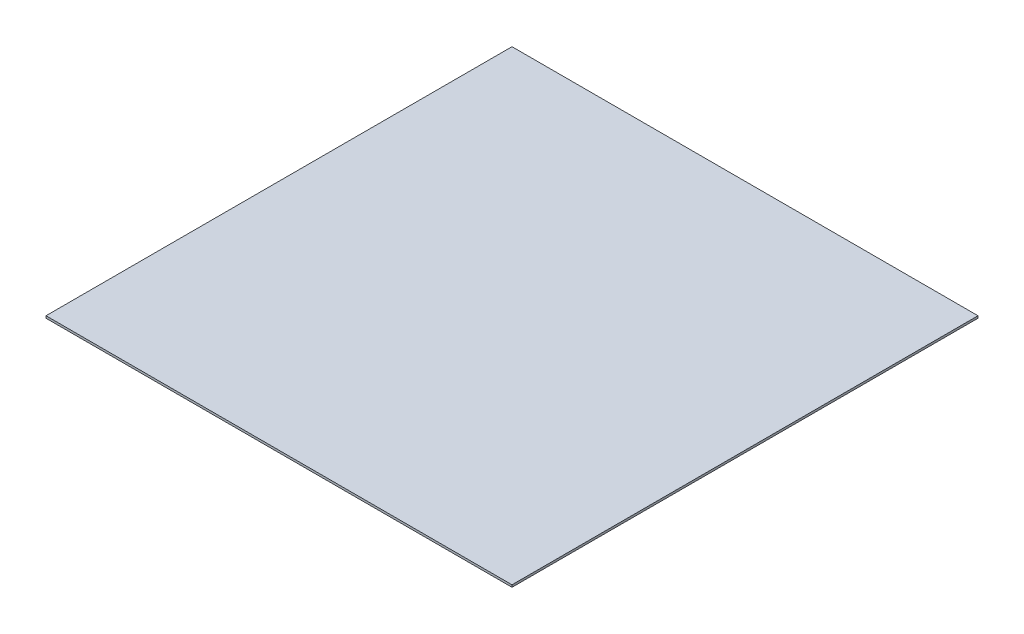
ISO-10303-21;
HEADER;
FILE_DESCRIPTION(('STEP AP214'),'2;1');
FILE_NAME('part.step','',(''),(''),'','','');
FILE_SCHEMA(('AUTOMOTIVE_DESIGN { 1 0 10303 214 1 1 1 1 }'));
ENDSEC;
DATA;
#1=APPLICATION_CONTEXT('core data for automotive mechanical design processes');
#2=APPLICATION_PROTOCOL_DEFINITION('international standard','automotive_design',2000,#1);
#3=PRODUCT_CONTEXT('',#1,'mechanical');
#4=PRODUCT('Part','Part','',(#3));
#5=PRODUCT_RELATED_PRODUCT_CATEGORY('part','',(#4));
#6=PRODUCT_DEFINITION_FORMATION('','',#4);
#7=PRODUCT_DEFINITION_CONTEXT('part definition',#1,'design');
#8=PRODUCT_DEFINITION('design','',#6,#7);
#9=PRODUCT_DEFINITION_SHAPE('','',#8);
#10=(LENGTH_UNIT() NAMED_UNIT(*) SI_UNIT(.MILLI.,.METRE.));
#11=(NAMED_UNIT(*) PLANE_ANGLE_UNIT() SI_UNIT($,.RADIAN.));
#12=(NAMED_UNIT(*) SI_UNIT($,.STERADIAN.) SOLID_ANGLE_UNIT());
#13=UNCERTAINTY_MEASURE_WITH_UNIT(LENGTH_MEASURE(1.E-05),#10,'distance_accuracy_value','');
#14=(GEOMETRIC_REPRESENTATION_CONTEXT(3) GLOBAL_UNCERTAINTY_ASSIGNED_CONTEXT((#13)) GLOBAL_UNIT_ASSIGNED_CONTEXT((#10,
#11,#12)) REPRESENTATION_CONTEXT('',''));
#15=CARTESIAN_POINT('',(0.,0.,0.));
#16=DIRECTION('',(0.,0.,1.));
#17=DIRECTION('',(1.,0.,0.));
#18=AXIS2_PLACEMENT_3D('',#15,#16,#17);
#19=CARTESIAN_POINT('',(-743.,7.,743.));
#20=DIRECTION('',(-1.,0.,0.));
#21=DIRECTION('',(0.,0.,1.));
#22=AXIS2_PLACEMENT_3D('',#19,#20,#21);
#23=PLANE('',#22);
#24=DIRECTION('',(0.,0.,-1.));
#25=VECTOR('',#24,1.);
#26=CARTESIAN_POINT('',(-743.,0.,743.));
#27=LINE('',#26,#25);
#28=CARTESIAN_POINT('',(-743.,0.,743.));
#29=VERTEX_POINT('',#28);
#30=CARTESIAN_POINT('',(-743.,0.,-743.));
#31=VERTEX_POINT('',#30);
#32=EDGE_CURVE('E101',#29,#31,#27,.T.);
#33=ORIENTED_EDGE('',*,*,#32,.F.);
#34=DIRECTION('',(0.,-1.,0.));
#35=VECTOR('',#34,1.);
#36=CARTESIAN_POINT('',(-743.,7.,743.));
#37=LINE('',#36,#35);
#38=CARTESIAN_POINT('',(-743.,7.,743.));
#39=VERTEX_POINT('',#38);
#40=EDGE_CURVE('E11',#39,#29,#37,.T.);
#41=ORIENTED_EDGE('',*,*,#40,.F.);
#42=DIRECTION('',(0.,0.,-1.));
#43=VECTOR('',#42,1.);
#44=CARTESIAN_POINT('',(-743.,7.,743.));
#45=LINE('',#44,#43);
#46=CARTESIAN_POINT('',(-743.,7.,-743.));
#47=VERTEX_POINT('',#46);
#48=EDGE_CURVE('E96',#39,#47,#45,.T.);
#49=ORIENTED_EDGE('',*,*,#48,.T.);
#50=DIRECTION('',(0.,-1.,0.));
#51=VECTOR('',#50,1.);
#52=CARTESIAN_POINT('',(-743.,7.,-743.));
#53=LINE('',#52,#51);
#54=EDGE_CURVE('E39',#47,#31,#53,.T.);
#55=ORIENTED_EDGE('',*,*,#54,.T.);
#56=EDGE_LOOP('',(#33,#41,#49,#55));
#57=FACE_BOUND('',#56,.T.);
#58=ADVANCED_FACE('F36',(#57),#23,.T.);
#59=CARTESIAN_POINT('',(-743.,7.,743.));
#60=DIRECTION('',(0.,0.,-1.));
#61=DIRECTION('',(-1.,0.,0.));
#62=AXIS2_PLACEMENT_3D('',#59,#60,#61);
#63=PLANE('',#62);
#64=DIRECTION('',(1.,0.,0.));
#65=VECTOR('',#64,1.);
#66=CARTESIAN_POINT('',(-743.,0.,743.));
#67=LINE('',#66,#65);
#68=CARTESIAN_POINT('',(743.,0.,743.));
#69=VERTEX_POINT('',#68);
#70=EDGE_CURVE('E69',#29,#69,#67,.T.);
#71=ORIENTED_EDGE('',*,*,#70,.T.);
#72=DIRECTION('',(0.,-1.,0.));
#73=VECTOR('',#72,1.);
#74=CARTESIAN_POINT('',(743.,7.,743.));
#75=LINE('',#74,#73);
#76=CARTESIAN_POINT('',(743.,7.,743.));
#77=VERTEX_POINT('',#76);
#78=EDGE_CURVE('E45',#77,#69,#75,.T.);
#79=ORIENTED_EDGE('',*,*,#78,.F.);
#80=DIRECTION('',(1.,0.,0.));
#81=VECTOR('',#80,1.);
#82=CARTESIAN_POINT('',(-743.,7.,743.));
#83=LINE('',#82,#81);
#84=EDGE_CURVE('E86',#39,#77,#83,.T.);
#85=ORIENTED_EDGE('',*,*,#84,.F.);
#86=ORIENTED_EDGE('',*,*,#40,.T.);
#87=EDGE_LOOP('',(#71,#79,#85,#86));
#88=FACE_BOUND('',#87,.T.);
#89=ADVANCED_FACE('F111',(#88),#63,.F.);
#90=CARTESIAN_POINT('',(743.,7.,743.));
#91=DIRECTION('',(-1.,0.,0.));
#92=DIRECTION('',(0.,0.,1.));
#93=AXIS2_PLACEMENT_3D('',#90,#91,#92);
#94=PLANE('',#93);
#95=DIRECTION('',(0.,0.,-1.));
#96=VECTOR('',#95,1.);
#97=CARTESIAN_POINT('',(743.,0.,743.));
#98=LINE('',#97,#96);
#99=CARTESIAN_POINT('',(743.,0.,-743.));
#100=VERTEX_POINT('',#99);
#101=EDGE_CURVE('E93',#69,#100,#98,.T.);
#102=ORIENTED_EDGE('',*,*,#101,.T.);
#103=DIRECTION('',(0.,-1.,0.));
#104=VECTOR('',#103,1.);
#105=CARTESIAN_POINT('',(743.,7.,-743.));
#106=LINE('',#105,#104);
#107=CARTESIAN_POINT('',(743.,7.,-743.));
#108=VERTEX_POINT('',#107);
#109=EDGE_CURVE('E90',#108,#100,#106,.T.);
#110=ORIENTED_EDGE('',*,*,#109,.F.);
#111=DIRECTION('',(0.,0.,-1.));
#112=VECTOR('',#111,1.);
#113=CARTESIAN_POINT('',(743.,7.,743.));
#114=LINE('',#113,#112);
#115=EDGE_CURVE('E81',#77,#108,#114,.T.);
#116=ORIENTED_EDGE('',*,*,#115,.F.);
#117=ORIENTED_EDGE('',*,*,#78,.T.);
#118=EDGE_LOOP('',(#102,#110,#116,#117));
#119=FACE_BOUND('',#118,.T.);
#120=ADVANCED_FACE('F91',(#119),#94,.F.);
#121=CARTESIAN_POINT('',(-743.,7.,-743.));
#122=DIRECTION('',(0.,0.,-1.));
#123=DIRECTION('',(-1.,0.,0.));
#124=AXIS2_PLACEMENT_3D('',#121,#122,#123);
#125=PLANE('',#124);
#126=DIRECTION('',(1.,0.,0.));
#127=VECTOR('',#126,1.);
#128=CARTESIAN_POINT('',(-743.,0.,-743.));
#129=LINE('',#128,#127);
#130=EDGE_CURVE('E104',#31,#100,#129,.T.);
#131=ORIENTED_EDGE('',*,*,#130,.F.);
#132=ORIENTED_EDGE('',*,*,#54,.F.);
#133=DIRECTION('',(1.,0.,0.));
#134=VECTOR('',#133,1.);
#135=CARTESIAN_POINT('',(-743.,7.,-743.));
#136=LINE('',#135,#134);
#137=EDGE_CURVE('E85',#47,#108,#136,.T.);
#138=ORIENTED_EDGE('',*,*,#137,.T.);
#139=ORIENTED_EDGE('',*,*,#109,.T.);
#140=EDGE_LOOP('',(#131,#132,#138,#139));
#141=FACE_BOUND('',#140,.T.);
#142=ADVANCED_FACE('F95',(#141),#125,.T.);
#143=CARTESIAN_POINT('',(0.,7.,0.));
#144=DIRECTION('',(0.,-1.,0.));
#145=DIRECTION('',(0.,0.,-1.));
#146=AXIS2_PLACEMENT_3D('',#143,#144,#145);
#147=PLANE('',#146);
#148=ORIENTED_EDGE('',*,*,#48,.F.);
#149=ORIENTED_EDGE('',*,*,#84,.T.);
#150=ORIENTED_EDGE('',*,*,#115,.T.);
#151=ORIENTED_EDGE('',*,*,#137,.F.);
#152=EDGE_LOOP('',(#148,#149,#150,#151));
#153=FACE_BOUND('',#152,.T.);
#154=ADVANCED_FACE('F84',(#153),#147,.F.);
#155=CARTESIAN_POINT('',(0.,0.,0.));
#156=DIRECTION('',(0.,-1.,0.));
#157=DIRECTION('',(0.,0.,-1.));
#158=AXIS2_PLACEMENT_3D('',#155,#156,#157);
#159=PLANE('',#158);
#160=ORIENTED_EDGE('',*,*,#32,.T.);
#161=ORIENTED_EDGE('',*,*,#130,.T.);
#162=ORIENTED_EDGE('',*,*,#101,.F.);
#163=ORIENTED_EDGE('',*,*,#70,.F.);
#164=EDGE_LOOP('',(#160,#161,#162,#163));
#165=FACE_BOUND('',#164,.T.);
#166=ADVANCED_FACE('F109',(#165),#159,.T.);
#167=CLOSED_SHELL('',(#58,#89,#120,#142,#154,#166));
#168=MANIFOLD_SOLID_BREP('B2',#167);
#169=ADVANCED_BREP_SHAPE_REPRESENTATION('',(#18,#168),#14);
#170=SHAPE_DEFINITION_REPRESENTATION(#9,#169);
ENDSEC;
END-ISO-10303-21;
